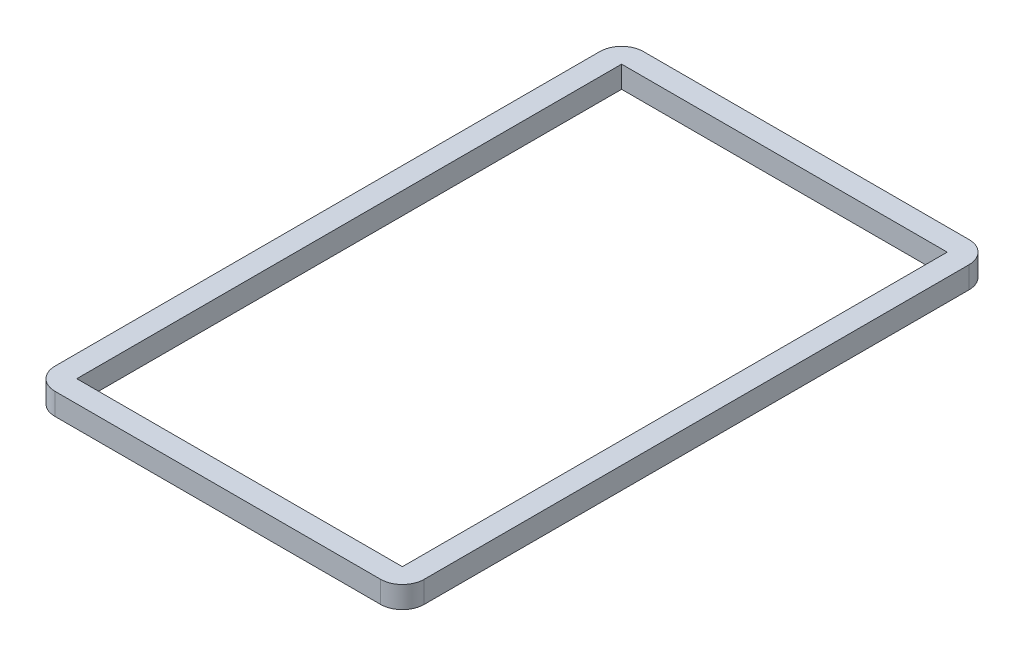
ISO-10303-21;
HEADER;
FILE_DESCRIPTION(('STEP AP214'),'2;1');
FILE_NAME('part.step','',(''),(''),'','','');
FILE_SCHEMA(('AUTOMOTIVE_DESIGN { 1 0 10303 214 1 1 1 1 }'));
ENDSEC;
DATA;
#1=APPLICATION_CONTEXT('core data for automotive mechanical design processes');
#2=APPLICATION_PROTOCOL_DEFINITION('international standard','automotive_design',2000,#1);
#3=PRODUCT_CONTEXT('',#1,'mechanical');
#4=PRODUCT('Part','Part','',(#3));
#5=PRODUCT_RELATED_PRODUCT_CATEGORY('part','',(#4));
#6=PRODUCT_DEFINITION_FORMATION('','',#4);
#7=PRODUCT_DEFINITION_CONTEXT('part definition',#1,'design');
#8=PRODUCT_DEFINITION('design','',#6,#7);
#9=PRODUCT_DEFINITION_SHAPE('','',#8);
#10=(LENGTH_UNIT() NAMED_UNIT(*) SI_UNIT(.MILLI.,.METRE.));
#11=(NAMED_UNIT(*) PLANE_ANGLE_UNIT() SI_UNIT($,.RADIAN.));
#12=(NAMED_UNIT(*) SI_UNIT($,.STERADIAN.) SOLID_ANGLE_UNIT());
#13=UNCERTAINTY_MEASURE_WITH_UNIT(LENGTH_MEASURE(1.E-05),#10,'distance_accuracy_value','');
#14=(GEOMETRIC_REPRESENTATION_CONTEXT(3) GLOBAL_UNCERTAINTY_ASSIGNED_CONTEXT((#13)) GLOBAL_UNIT_ASSIGNED_CONTEXT((#10,
#11,#12)) REPRESENTATION_CONTEXT('',''));
#15=CARTESIAN_POINT('',(0.,0.,0.));
#16=DIRECTION('',(0.,0.,1.));
#17=DIRECTION('',(1.,0.,0.));
#18=AXIS2_PLACEMENT_3D('',#15,#16,#17);
#19=CARTESIAN_POINT('',(22.4,3.,-37.48125));
#20=DIRECTION('',(0.,-1.,0.));
#21=DIRECTION('',(0.,0.,-1.));
#22=AXIS2_PLACEMENT_3D('',#19,#20,#21);
#23=PLANE('',#22);
#24=CARTESIAN_POINT('',(22.4,3.,-37.48125));
#25=DIRECTION('',(0.,1.,0.));
#26=DIRECTION('',(0.,0.,-1.));
#27=AXIS2_PLACEMENT_3D('',#24,#25,#26);
#28=CIRCLE('',#27,3.);
#29=CARTESIAN_POINT('',(25.4,3.,-37.48125));
#30=VERTEX_POINT('',#29);
#31=CARTESIAN_POINT('',(22.4,3.,-40.48125));
#32=VERTEX_POINT('',#31);
#33=EDGE_CURVE('E158',#30,#32,#28,.T.);
#34=ORIENTED_EDGE('',*,*,#33,.T.);
#35=DIRECTION('',(-1.,0.,0.));
#36=VECTOR('',#35,1.);
#37=CARTESIAN_POINT('',(-22.4,3.,-40.48125));
#38=LINE('',#37,#36);
#39=CARTESIAN_POINT('',(-22.4,3.,-40.48125));
#40=VERTEX_POINT('',#39);
#41=EDGE_CURVE('E161',#32,#40,#38,.T.);
#42=ORIENTED_EDGE('',*,*,#41,.T.);
#43=CARTESIAN_POINT('',(-22.4,3.,-37.48125));
#44=DIRECTION('',(0.,1.,0.));
#45=DIRECTION('',(0.,0.,-1.));
#46=AXIS2_PLACEMENT_3D('',#43,#44,#45);
#47=CIRCLE('',#46,3.);
#48=CARTESIAN_POINT('',(-25.4,3.,-37.48125));
#49=VERTEX_POINT('',#48);
#50=EDGE_CURVE('E164',#40,#49,#47,.T.);
#51=ORIENTED_EDGE('',*,*,#50,.T.);
#52=DIRECTION('',(0.,0.,1.));
#53=VECTOR('',#52,1.);
#54=CARTESIAN_POINT('',(-25.4,3.,37.48125));
#55=LINE('',#54,#53);
#56=CARTESIAN_POINT('',(-25.4,3.,37.48125));
#57=VERTEX_POINT('',#56);
#58=EDGE_CURVE('E166',#49,#57,#55,.T.);
#59=ORIENTED_EDGE('',*,*,#58,.T.);
#60=CARTESIAN_POINT('',(-22.4,3.,37.48125));
#61=DIRECTION('',(0.,1.,0.));
#62=DIRECTION('',(0.,0.,-1.));
#63=AXIS2_PLACEMENT_3D('',#60,#61,#62);
#64=CIRCLE('',#63,3.);
#65=CARTESIAN_POINT('',(-22.4,3.,40.48125));
#66=VERTEX_POINT('',#65);
#67=EDGE_CURVE('E168',#57,#66,#64,.T.);
#68=ORIENTED_EDGE('',*,*,#67,.T.);
#69=DIRECTION('',(1.,0.,0.));
#70=VECTOR('',#69,1.);
#71=CARTESIAN_POINT('',(-22.4,3.,40.48125));
#72=LINE('',#71,#70);
#73=CARTESIAN_POINT('',(22.4,3.,40.48125));
#74=VERTEX_POINT('',#73);
#75=EDGE_CURVE('E170',#66,#74,#72,.T.);
#76=ORIENTED_EDGE('',*,*,#75,.T.);
#77=CARTESIAN_POINT('',(22.4,3.,37.48125));
#78=DIRECTION('',(0.,1.,0.));
#79=DIRECTION('',(0.,0.,-1.));
#80=AXIS2_PLACEMENT_3D('',#77,#78,#79);
#81=CIRCLE('',#80,3.);
#82=CARTESIAN_POINT('',(25.4,3.,37.48125));
#83=VERTEX_POINT('',#82);
#84=EDGE_CURVE('E172',#74,#83,#81,.T.);
#85=ORIENTED_EDGE('',*,*,#84,.T.);
#86=DIRECTION('',(0.,0.,-1.));
#87=VECTOR('',#86,1.);
#88=CARTESIAN_POINT('',(25.4,3.,37.48125));
#89=LINE('',#88,#87);
#90=EDGE_CURVE('E174',#83,#30,#89,.T.);
#91=ORIENTED_EDGE('',*,*,#90,.T.);
#92=EDGE_LOOP('',(#34,#42,#51,#59,#68,#76,#85,#91));
#93=FACE_BOUND('',#92,.T.);
#94=DIRECTION('',(0.,0.,1.));
#95=VECTOR('',#94,1.);
#96=CARTESIAN_POINT('',(-22.4,3.,37.48125));
#97=LINE('',#96,#95);
#98=CARTESIAN_POINT('',(-22.4,3.,-37.48125));
#99=VERTEX_POINT('',#98);
#100=CARTESIAN_POINT('',(-22.4,3.,37.48125));
#101=VERTEX_POINT('',#100);
#102=EDGE_CURVE('E122',#99,#101,#97,.T.);
#103=ORIENTED_EDGE('',*,*,#102,.F.);
#104=DIRECTION('',(-1.,0.,0.));
#105=VECTOR('',#104,1.);
#106=CARTESIAN_POINT('',(-22.4,3.,-37.48125));
#107=LINE('',#106,#105);
#108=CARTESIAN_POINT('',(22.4,3.,-37.48125));
#109=VERTEX_POINT('',#108);
#110=EDGE_CURVE('E144',#109,#99,#107,.T.);
#111=ORIENTED_EDGE('',*,*,#110,.F.);
#112=DIRECTION('',(0.,0.,-1.));
#113=VECTOR('',#112,1.);
#114=CARTESIAN_POINT('',(22.4,3.,37.48125));
#115=LINE('',#114,#113);
#116=CARTESIAN_POINT('',(22.4,3.,37.48125));
#117=VERTEX_POINT('',#116);
#118=EDGE_CURVE('E142',#117,#109,#115,.T.);
#119=ORIENTED_EDGE('',*,*,#118,.F.);
#120=DIRECTION('',(1.,0.,0.));
#121=VECTOR('',#120,1.);
#122=CARTESIAN_POINT('',(-22.4,3.,37.48125));
#123=LINE('',#122,#121);
#124=EDGE_CURVE('E130',#101,#117,#123,.T.);
#125=ORIENTED_EDGE('',*,*,#124,.F.);
#126=EDGE_LOOP('',(#103,#111,#119,#125));
#127=FACE_BOUND('',#126,.T.);
#128=ADVANCED_FACE('F33',(#93,#127),#23,.F.);
#129=CARTESIAN_POINT('',(22.4,0.,-37.48125));
#130=DIRECTION('',(0.,-1.,0.));
#131=DIRECTION('',(0.,0.,-1.));
#132=AXIS2_PLACEMENT_3D('',#129,#130,#131);
#133=PLANE('',#132);
#134=CARTESIAN_POINT('',(22.4,0.,-37.48125));
#135=DIRECTION('',(0.,1.,0.));
#136=DIRECTION('',(0.,0.,-1.));
#137=AXIS2_PLACEMENT_3D('',#134,#135,#136);
#138=CIRCLE('',#137,3.);
#139=CARTESIAN_POINT('',(25.4,0.,-37.48125));
#140=VERTEX_POINT('',#139);
#141=CARTESIAN_POINT('',(22.4,0.,-40.48125));
#142=VERTEX_POINT('',#141);
#143=EDGE_CURVE('E138',#140,#142,#138,.T.);
#144=ORIENTED_EDGE('',*,*,#143,.F.);
#145=DIRECTION('',(0.,0.,-1.));
#146=VECTOR('',#145,1.);
#147=CARTESIAN_POINT('',(25.4,0.,37.48125));
#148=LINE('',#147,#146);
#149=CARTESIAN_POINT('',(25.4,0.,37.48125));
#150=VERTEX_POINT('',#149);
#151=EDGE_CURVE('E162',#150,#140,#148,.T.);
#152=ORIENTED_EDGE('',*,*,#151,.F.);
#153=CARTESIAN_POINT('',(22.4,0.,37.48125));
#154=DIRECTION('',(0.,1.,0.));
#155=DIRECTION('',(0.,0.,-1.));
#156=AXIS2_PLACEMENT_3D('',#153,#154,#155);
#157=CIRCLE('',#156,3.);
#158=CARTESIAN_POINT('',(22.4,0.,40.48125));
#159=VERTEX_POINT('',#158);
#160=EDGE_CURVE('E189',#159,#150,#157,.T.);
#161=ORIENTED_EDGE('',*,*,#160,.F.);
#162=DIRECTION('',(1.,0.,0.));
#163=VECTOR('',#162,1.);
#164=CARTESIAN_POINT('',(-22.4,0.,40.48125));
#165=LINE('',#164,#163);
#166=CARTESIAN_POINT('',(-22.4,0.,40.48125));
#167=VERTEX_POINT('',#166);
#168=EDGE_CURVE('E187',#167,#159,#165,.T.);
#169=ORIENTED_EDGE('',*,*,#168,.F.);
#170=CARTESIAN_POINT('',(-22.4,0.,37.48125));
#171=DIRECTION('',(0.,1.,0.));
#172=DIRECTION('',(0.,0.,-1.));
#173=AXIS2_PLACEMENT_3D('',#170,#171,#172);
#174=CIRCLE('',#173,3.);
#175=CARTESIAN_POINT('',(-25.4,0.,37.48125));
#176=VERTEX_POINT('',#175);
#177=EDGE_CURVE('E185',#176,#167,#174,.T.);
#178=ORIENTED_EDGE('',*,*,#177,.F.);
#179=DIRECTION('',(0.,0.,1.));
#180=VECTOR('',#179,1.);
#181=CARTESIAN_POINT('',(-25.4,0.,37.48125));
#182=LINE('',#181,#180);
#183=CARTESIAN_POINT('',(-25.4,0.,-37.48125));
#184=VERTEX_POINT('',#183);
#185=EDGE_CURVE('E183',#184,#176,#182,.T.);
#186=ORIENTED_EDGE('',*,*,#185,.F.);
#187=CARTESIAN_POINT('',(-22.4,0.,-37.48125));
#188=DIRECTION('',(0.,1.,0.));
#189=DIRECTION('',(0.,0.,-1.));
#190=AXIS2_PLACEMENT_3D('',#187,#188,#189);
#191=CIRCLE('',#190,3.);
#192=CARTESIAN_POINT('',(-22.4,0.,-40.48125));
#193=VERTEX_POINT('',#192);
#194=EDGE_CURVE('E181',#193,#184,#191,.T.);
#195=ORIENTED_EDGE('',*,*,#194,.F.);
#196=DIRECTION('',(-1.,0.,0.));
#197=VECTOR('',#196,1.);
#198=CARTESIAN_POINT('',(-22.4,0.,-40.48125));
#199=LINE('',#198,#197);
#200=EDGE_CURVE('E179',#142,#193,#199,.T.);
#201=ORIENTED_EDGE('',*,*,#200,.F.);
#202=EDGE_LOOP('',(#144,#152,#161,#169,#178,#186,#195,#201));
#203=FACE_BOUND('',#202,.T.);
#204=DIRECTION('',(-1.,0.,0.));
#205=VECTOR('',#204,1.);
#206=CARTESIAN_POINT('',(-22.4,0.,-37.48125));
#207=LINE('',#206,#205);
#208=CARTESIAN_POINT('',(22.4,0.,-37.48125));
#209=VERTEX_POINT('',#208);
#210=CARTESIAN_POINT('',(-22.4,0.,-37.48125));
#211=VERTEX_POINT('',#210);
#212=EDGE_CURVE('E131',#209,#211,#207,.T.);
#213=ORIENTED_EDGE('',*,*,#212,.T.);
#214=DIRECTION('',(0.,0.,1.));
#215=VECTOR('',#214,1.);
#216=CARTESIAN_POINT('',(-22.4,0.,37.48125));
#217=LINE('',#216,#215);
#218=CARTESIAN_POINT('',(-22.4,0.,37.48125));
#219=VERTEX_POINT('',#218);
#220=EDGE_CURVE('E56',#211,#219,#217,.T.);
#221=ORIENTED_EDGE('',*,*,#220,.T.);
#222=DIRECTION('',(1.,0.,0.));
#223=VECTOR('',#222,1.);
#224=CARTESIAN_POINT('',(-22.4,0.,37.48125));
#225=LINE('',#224,#223);
#226=CARTESIAN_POINT('',(22.4,0.,37.48125));
#227=VERTEX_POINT('',#226);
#228=EDGE_CURVE('E137',#219,#227,#225,.T.);
#229=ORIENTED_EDGE('',*,*,#228,.T.);
#230=DIRECTION('',(0.,0.,-1.));
#231=VECTOR('',#230,1.);
#232=CARTESIAN_POINT('',(22.4,0.,37.48125));
#233=LINE('',#232,#231);
#234=EDGE_CURVE('E150',#227,#209,#233,.T.);
#235=ORIENTED_EDGE('',*,*,#234,.T.);
#236=EDGE_LOOP('',(#213,#221,#229,#235));
#237=FACE_BOUND('',#236,.T.);
#238=ADVANCED_FACE('F219',(#203,#237),#133,.T.);
#239=CARTESIAN_POINT('',(22.4,3.,-37.48125));
#240=DIRECTION('',(0.,-1.,0.));
#241=DIRECTION('',(0.,0.,-1.));
#242=AXIS2_PLACEMENT_3D('',#239,#240,#241);
#243=CYLINDRICAL_SURFACE('',#242,3.);
#244=ORIENTED_EDGE('',*,*,#143,.T.);
#245=DIRECTION('',(0.,-1.,0.));
#246=VECTOR('',#245,1.);
#247=CARTESIAN_POINT('',(22.4,3.,-40.48125));
#248=LINE('',#247,#246);
#249=EDGE_CURVE('E11',#32,#142,#248,.T.);
#250=ORIENTED_EDGE('',*,*,#249,.F.);
#251=ORIENTED_EDGE('',*,*,#33,.F.);
#252=DIRECTION('',(0.,-1.,0.));
#253=VECTOR('',#252,1.);
#254=CARTESIAN_POINT('',(25.4,3.,-37.48125));
#255=LINE('',#254,#253);
#256=EDGE_CURVE('E176',#30,#140,#255,.T.);
#257=ORIENTED_EDGE('',*,*,#256,.T.);
#258=EDGE_LOOP('',(#244,#250,#251,#257));
#259=FACE_BOUND('',#258,.T.);
#260=ADVANCED_FACE('F35',(#259),#243,.T.);
#261=CARTESIAN_POINT('',(-22.4,3.,-40.48125));
#262=DIRECTION('',(0.,0.,1.));
#263=DIRECTION('',(1.,0.,0.));
#264=AXIS2_PLACEMENT_3D('',#261,#262,#263);
#265=PLANE('',#264);
#266=ORIENTED_EDGE('',*,*,#200,.T.);
#267=DIRECTION('',(0.,-1.,0.));
#268=VECTOR('',#267,1.);
#269=CARTESIAN_POINT('',(-22.4,3.,-40.48125));
#270=LINE('',#269,#268);
#271=EDGE_CURVE('E41',#40,#193,#270,.T.);
#272=ORIENTED_EDGE('',*,*,#271,.F.);
#273=ORIENTED_EDGE('',*,*,#41,.F.);
#274=ORIENTED_EDGE('',*,*,#249,.T.);
#275=EDGE_LOOP('',(#266,#272,#273,#274));
#276=FACE_BOUND('',#275,.T.);
#277=ADVANCED_FACE('F236',(#276),#265,.F.);
#278=CARTESIAN_POINT('',(-22.4,3.,-37.48125));
#279=DIRECTION('',(0.,-1.,0.));
#280=DIRECTION('',(0.,0.,-1.));
#281=AXIS2_PLACEMENT_3D('',#278,#279,#280);
#282=CYLINDRICAL_SURFACE('',#281,3.);
#283=ORIENTED_EDGE('',*,*,#194,.T.);
#284=DIRECTION('',(0.,-1.,0.));
#285=VECTOR('',#284,1.);
#286=CARTESIAN_POINT('',(-25.4,3.,-37.48125));
#287=LINE('',#286,#285);
#288=EDGE_CURVE('E206',#49,#184,#287,.T.);
#289=ORIENTED_EDGE('',*,*,#288,.F.);
#290=ORIENTED_EDGE('',*,*,#50,.F.);
#291=ORIENTED_EDGE('',*,*,#271,.T.);
#292=EDGE_LOOP('',(#283,#289,#290,#291));
#293=FACE_BOUND('',#292,.T.);
#294=ADVANCED_FACE('F213',(#293),#282,.T.);
#295=CARTESIAN_POINT('',(-25.4,3.,37.48125));
#296=DIRECTION('',(1.,0.,0.));
#297=DIRECTION('',(0.,0.,-1.));
#298=AXIS2_PLACEMENT_3D('',#295,#296,#297);
#299=PLANE('',#298);
#300=ORIENTED_EDGE('',*,*,#185,.T.);
#301=DIRECTION('',(0.,-1.,0.));
#302=VECTOR('',#301,1.);
#303=CARTESIAN_POINT('',(-25.4,3.,37.48125));
#304=LINE('',#303,#302);
#305=EDGE_CURVE('E203',#57,#176,#304,.T.);
#306=ORIENTED_EDGE('',*,*,#305,.F.);
#307=ORIENTED_EDGE('',*,*,#58,.F.);
#308=ORIENTED_EDGE('',*,*,#288,.T.);
#309=EDGE_LOOP('',(#300,#306,#307,#308));
#310=FACE_BOUND('',#309,.T.);
#311=ADVANCED_FACE('F225',(#310),#299,.F.);
#312=CARTESIAN_POINT('',(-22.4,3.,37.48125));
#313=DIRECTION('',(0.,-1.,0.));
#314=DIRECTION('',(0.,0.,-1.));
#315=AXIS2_PLACEMENT_3D('',#312,#313,#314);
#316=CYLINDRICAL_SURFACE('',#315,3.);
#317=ORIENTED_EDGE('',*,*,#177,.T.);
#318=DIRECTION('',(0.,-1.,0.));
#319=VECTOR('',#318,1.);
#320=CARTESIAN_POINT('',(-22.4,3.,40.48125));
#321=LINE('',#320,#319);
#322=EDGE_CURVE('E200',#66,#167,#321,.T.);
#323=ORIENTED_EDGE('',*,*,#322,.F.);
#324=ORIENTED_EDGE('',*,*,#67,.F.);
#325=ORIENTED_EDGE('',*,*,#305,.T.);
#326=EDGE_LOOP('',(#317,#323,#324,#325));
#327=FACE_BOUND('',#326,.T.);
#328=ADVANCED_FACE('F229',(#327),#316,.T.);
#329=CARTESIAN_POINT('',(-22.4,3.,40.48125));
#330=DIRECTION('',(0.,0.,-1.));
#331=DIRECTION('',(-1.,0.,0.));
#332=AXIS2_PLACEMENT_3D('',#329,#330,#331);
#333=PLANE('',#332);
#334=ORIENTED_EDGE('',*,*,#168,.T.);
#335=DIRECTION('',(0.,-1.,0.));
#336=VECTOR('',#335,1.);
#337=CARTESIAN_POINT('',(22.4,3.,40.48125));
#338=LINE('',#337,#336);
#339=EDGE_CURVE('E197',#74,#159,#338,.T.);
#340=ORIENTED_EDGE('',*,*,#339,.F.);
#341=ORIENTED_EDGE('',*,*,#75,.F.);
#342=ORIENTED_EDGE('',*,*,#322,.T.);
#343=EDGE_LOOP('',(#334,#340,#341,#342));
#344=FACE_BOUND('',#343,.T.);
#345=ADVANCED_FACE('F249',(#344),#333,.F.);
#346=CARTESIAN_POINT('',(22.4,3.,37.48125));
#347=DIRECTION('',(0.,-1.,0.));
#348=DIRECTION('',(0.,0.,-1.));
#349=AXIS2_PLACEMENT_3D('',#346,#347,#348);
#350=CYLINDRICAL_SURFACE('',#349,3.);
#351=ORIENTED_EDGE('',*,*,#160,.T.);
#352=DIRECTION('',(0.,-1.,0.));
#353=VECTOR('',#352,1.);
#354=CARTESIAN_POINT('',(25.4,3.,37.48125));
#355=LINE('',#354,#353);
#356=EDGE_CURVE('E194',#83,#150,#355,.T.);
#357=ORIENTED_EDGE('',*,*,#356,.F.);
#358=ORIENTED_EDGE('',*,*,#84,.F.);
#359=ORIENTED_EDGE('',*,*,#339,.T.);
#360=EDGE_LOOP('',(#351,#357,#358,#359));
#361=FACE_BOUND('',#360,.T.);
#362=ADVANCED_FACE('F247',(#361),#350,.T.);
#363=CARTESIAN_POINT('',(25.4,3.,37.48125));
#364=DIRECTION('',(-1.,0.,0.));
#365=DIRECTION('',(0.,0.,1.));
#366=AXIS2_PLACEMENT_3D('',#363,#364,#365);
#367=PLANE('',#366);
#368=ORIENTED_EDGE('',*,*,#151,.T.);
#369=ORIENTED_EDGE('',*,*,#256,.F.);
#370=ORIENTED_EDGE('',*,*,#90,.F.);
#371=ORIENTED_EDGE('',*,*,#356,.T.);
#372=EDGE_LOOP('',(#368,#369,#370,#371));
#373=FACE_BOUND('',#372,.T.);
#374=ADVANCED_FACE('F242',(#373),#367,.F.);
#375=CARTESIAN_POINT('',(-22.4,3.,37.48125));
#376=DIRECTION('',(1.,0.,0.));
#377=DIRECTION('',(0.,0.,-1.));
#378=AXIS2_PLACEMENT_3D('',#375,#376,#377);
#379=PLANE('',#378);
#380=ORIENTED_EDGE('',*,*,#220,.F.);
#381=DIRECTION('',(0.,-1.,0.));
#382=VECTOR('',#381,1.);
#383=CARTESIAN_POINT('',(-22.4,3.,-37.48125));
#384=LINE('',#383,#382);
#385=EDGE_CURVE('E126',#99,#211,#384,.T.);
#386=ORIENTED_EDGE('',*,*,#385,.F.);
#387=ORIENTED_EDGE('',*,*,#102,.T.);
#388=DIRECTION('',(0.,-1.,0.));
#389=VECTOR('',#388,1.);
#390=CARTESIAN_POINT('',(-22.4,3.,37.48125));
#391=LINE('',#390,#389);
#392=EDGE_CURVE('E125',#101,#219,#391,.T.);
#393=ORIENTED_EDGE('',*,*,#392,.T.);
#394=EDGE_LOOP('',(#380,#386,#387,#393));
#395=FACE_BOUND('',#394,.T.);
#396=ADVANCED_FACE('F124',(#395),#379,.T.);
#397=CARTESIAN_POINT('',(-22.4,3.,37.48125));
#398=DIRECTION('',(0.,0.,-1.));
#399=DIRECTION('',(-1.,0.,0.));
#400=AXIS2_PLACEMENT_3D('',#397,#398,#399);
#401=PLANE('',#400);
#402=ORIENTED_EDGE('',*,*,#228,.F.);
#403=ORIENTED_EDGE('',*,*,#392,.F.);
#404=ORIENTED_EDGE('',*,*,#124,.T.);
#405=DIRECTION('',(0.,-1.,0.));
#406=VECTOR('',#405,1.);
#407=CARTESIAN_POINT('',(22.4,3.,37.48125));
#408=LINE('',#407,#406);
#409=EDGE_CURVE('E139',#117,#227,#408,.T.);
#410=ORIENTED_EDGE('',*,*,#409,.T.);
#411=EDGE_LOOP('',(#402,#403,#404,#410));
#412=FACE_BOUND('',#411,.T.);
#413=ADVANCED_FACE('F134',(#412),#401,.T.);
#414=CARTESIAN_POINT('',(22.4,3.,37.48125));
#415=DIRECTION('',(-1.,0.,0.));
#416=DIRECTION('',(0.,0.,1.));
#417=AXIS2_PLACEMENT_3D('',#414,#415,#416);
#418=PLANE('',#417);
#419=ORIENTED_EDGE('',*,*,#234,.F.);
#420=ORIENTED_EDGE('',*,*,#409,.F.);
#421=ORIENTED_EDGE('',*,*,#118,.T.);
#422=DIRECTION('',(0.,-1.,0.));
#423=VECTOR('',#422,1.);
#424=CARTESIAN_POINT('',(22.4,3.,-37.48125));
#425=LINE('',#424,#423);
#426=EDGE_CURVE('E48',#109,#209,#425,.T.);
#427=ORIENTED_EDGE('',*,*,#426,.T.);
#428=EDGE_LOOP('',(#419,#420,#421,#427));
#429=FACE_BOUND('',#428,.T.);
#430=ADVANCED_FACE('F274',(#429),#418,.T.);
#431=CARTESIAN_POINT('',(-22.4,3.,-37.48125));
#432=DIRECTION('',(0.,0.,1.));
#433=DIRECTION('',(1.,0.,0.));
#434=AXIS2_PLACEMENT_3D('',#431,#432,#433);
#435=PLANE('',#434);
#436=ORIENTED_EDGE('',*,*,#212,.F.);
#437=ORIENTED_EDGE('',*,*,#426,.F.);
#438=ORIENTED_EDGE('',*,*,#110,.T.);
#439=ORIENTED_EDGE('',*,*,#385,.T.);
#440=EDGE_LOOP('',(#436,#437,#438,#439));
#441=FACE_BOUND('',#440,.T.);
#442=ADVANCED_FACE('F278',(#441),#435,.T.);
#443=CLOSED_SHELL('',(#128,#238,#260,#277,#294,#311,#328,#345,#362,#374,#396,#413,#430,#442));
#444=MANIFOLD_SOLID_BREP('B2',#443);
#445=ADVANCED_BREP_SHAPE_REPRESENTATION('',(#18,#444),#14);
#446=SHAPE_DEFINITION_REPRESENTATION(#9,#445);
ENDSEC;
END-ISO-10303-21;
